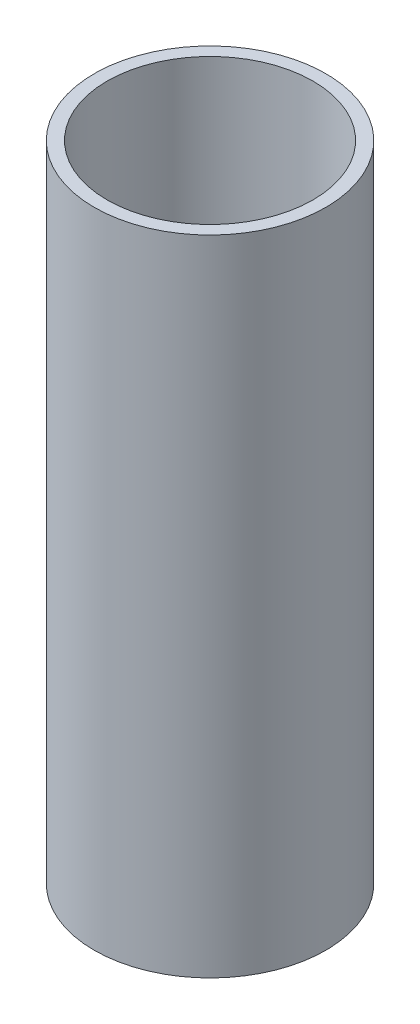
ISO-10303-21;
HEADER;
FILE_DESCRIPTION(('STEP AP214'),'2;1');
FILE_NAME('part.step','',(''),(''),'','','');
FILE_SCHEMA(('AUTOMOTIVE_DESIGN { 1 0 10303 214 1 1 1 1 }'));
ENDSEC;
DATA;
#1=APPLICATION_CONTEXT('core data for automotive mechanical design processes');
#2=APPLICATION_PROTOCOL_DEFINITION('international standard','automotive_design',2000,#1);
#3=PRODUCT_CONTEXT('',#1,'mechanical');
#4=PRODUCT('Part','Part','',(#3));
#5=PRODUCT_RELATED_PRODUCT_CATEGORY('part','',(#4));
#6=PRODUCT_DEFINITION_FORMATION('','',#4);
#7=PRODUCT_DEFINITION_CONTEXT('part definition',#1,'design');
#8=PRODUCT_DEFINITION('design','',#6,#7);
#9=PRODUCT_DEFINITION_SHAPE('','',#8);
#10=(LENGTH_UNIT() NAMED_UNIT(*) SI_UNIT(.MILLI.,.METRE.));
#11=(NAMED_UNIT(*) PLANE_ANGLE_UNIT() SI_UNIT($,.RADIAN.));
#12=(NAMED_UNIT(*) SI_UNIT($,.STERADIAN.) SOLID_ANGLE_UNIT());
#13=UNCERTAINTY_MEASURE_WITH_UNIT(LENGTH_MEASURE(1.E-05),#10,'distance_accuracy_value','');
#14=(GEOMETRIC_REPRESENTATION_CONTEXT(3) GLOBAL_UNCERTAINTY_ASSIGNED_CONTEXT((#13)) GLOBAL_UNIT_ASSIGNED_CONTEXT((#10,
#11,#12)) REPRESENTATION_CONTEXT('',''));
#15=CARTESIAN_POINT('',(0.,0.,0.));
#16=DIRECTION('',(0.,0.,1.));
#17=DIRECTION('',(1.,0.,0.));
#18=AXIS2_PLACEMENT_3D('',#15,#16,#17);
#19=CARTESIAN_POINT('',(0.,250.,0.));
#20=DIRECTION('',(0.,1.,0.));
#21=DIRECTION('',(0.,0.,1.));
#22=AXIS2_PLACEMENT_3D('',#19,#20,#21);
#23=PLANE('',#22);
#24=CARTESIAN_POINT('',(0.,250.,0.));
#25=DIRECTION('',(0.,1.,0.));
#26=DIRECTION('',(0.,0.,1.));
#27=AXIS2_PLACEMENT_3D('',#24,#25,#26);
#28=CIRCLE('',#27,45.);
#29=CARTESIAN_POINT('',(0.,250.,45.));
#30=VERTEX_POINT('',#29);
#31=EDGE_CURVE('E11',#30,#30,#28,.T.);
#32=ORIENTED_EDGE('',*,*,#31,.T.);
#33=EDGE_LOOP('',(#32));
#34=FACE_BOUND('',#33,.T.);
#35=CARTESIAN_POINT('',(0.,250.,0.));
#36=DIRECTION('',(0.,1.,0.));
#37=DIRECTION('',(0.,0.,1.));
#38=AXIS2_PLACEMENT_3D('',#35,#36,#37);
#39=CIRCLE('',#38,40.);
#40=CARTESIAN_POINT('',(0.,250.,40.));
#41=VERTEX_POINT('',#40);
#42=EDGE_CURVE('E48',#41,#41,#39,.T.);
#43=ORIENTED_EDGE('',*,*,#42,.F.);
#44=EDGE_LOOP('',(#43));
#45=FACE_BOUND('',#44,.T.);
#46=ADVANCED_FACE('F37',(#34,#45),#23,.T.);
#47=CARTESIAN_POINT('',(0.,0.,0.));
#48=DIRECTION('',(0.,1.,0.));
#49=DIRECTION('',(0.,0.,1.));
#50=AXIS2_PLACEMENT_3D('',#47,#48,#49);
#51=PLANE('',#50);
#52=CARTESIAN_POINT('',(0.,0.,0.));
#53=DIRECTION('',(0.,1.,0.));
#54=DIRECTION('',(0.,0.,1.));
#55=AXIS2_PLACEMENT_3D('',#52,#53,#54);
#56=CIRCLE('',#55,45.);
#57=CARTESIAN_POINT('',(0.,0.,45.));
#58=VERTEX_POINT('',#57);
#59=EDGE_CURVE('E41',#58,#58,#56,.T.);
#60=ORIENTED_EDGE('',*,*,#59,.F.);
#61=EDGE_LOOP('',(#60));
#62=FACE_BOUND('',#61,.T.);
#63=CARTESIAN_POINT('',(0.,0.,0.));
#64=DIRECTION('',(0.,1.,0.));
#65=DIRECTION('',(0.,0.,1.));
#66=AXIS2_PLACEMENT_3D('',#63,#64,#65);
#67=CIRCLE('',#66,40.);
#68=CARTESIAN_POINT('',(0.,0.,40.));
#69=VERTEX_POINT('',#68);
#70=EDGE_CURVE('E50',#69,#69,#67,.T.);
#71=ORIENTED_EDGE('',*,*,#70,.T.);
#72=EDGE_LOOP('',(#71));
#73=FACE_BOUND('',#72,.T.);
#74=ADVANCED_FACE('F60',(#62,#73),#51,.F.);
#75=CARTESIAN_POINT('',(0.,250.,0.));
#76=DIRECTION('',(0.,-1.,0.));
#77=DIRECTION('',(0.,0.,-1.));
#78=AXIS2_PLACEMENT_3D('',#75,#76,#77);
#79=CYLINDRICAL_SURFACE('',#78,45.);
#80=ORIENTED_EDGE('',*,*,#31,.F.);
#81=EDGE_LOOP('',(#80));
#82=FACE_BOUND('',#81,.T.);
#83=ORIENTED_EDGE('',*,*,#59,.T.);
#84=EDGE_LOOP('',(#83));
#85=FACE_BOUND('',#84,.T.);
#86=ADVANCED_FACE('F39',(#82,#85),#79,.T.);
#87=CARTESIAN_POINT('',(0.,250.,0.));
#88=DIRECTION('',(0.,-1.,0.));
#89=DIRECTION('',(0.,0.,-1.));
#90=AXIS2_PLACEMENT_3D('',#87,#88,#89);
#91=CYLINDRICAL_SURFACE('',#90,40.);
#92=ORIENTED_EDGE('',*,*,#42,.T.);
#93=EDGE_LOOP('',(#92));
#94=FACE_BOUND('',#93,.T.);
#95=ORIENTED_EDGE('',*,*,#70,.F.);
#96=EDGE_LOOP('',(#95));
#97=FACE_BOUND('',#96,.T.);
#98=ADVANCED_FACE('F56',(#94,#97),#91,.F.);
#99=CLOSED_SHELL('',(#46,#74,#86,#98));
#100=MANIFOLD_SOLID_BREP('B2',#99);
#101=ADVANCED_BREP_SHAPE_REPRESENTATION('',(#18,#100),#14);
#102=SHAPE_DEFINITION_REPRESENTATION(#9,#101);
ENDSEC;
END-ISO-10303-21;
